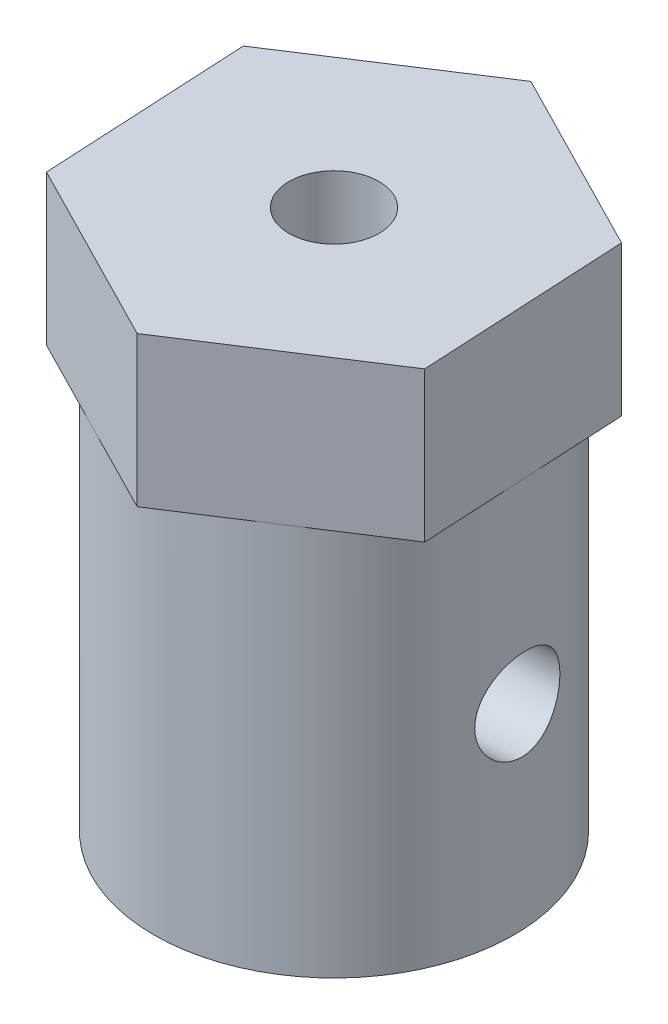
ISO-10303-21;
HEADER;
FILE_DESCRIPTION(('STEP AP214'),'2;1');
FILE_NAME('part.step','',(''),(''),'','','');
FILE_SCHEMA(('AUTOMOTIVE_DESIGN { 1 0 10303 214 1 1 1 1 }'));
ENDSEC;
DATA;
#1=APPLICATION_CONTEXT('core data for automotive mechanical design processes');
#2=APPLICATION_PROTOCOL_DEFINITION('international standard','automotive_design',2000,#1);
#3=PRODUCT_CONTEXT('',#1,'mechanical');
#4=PRODUCT('Part','Part','',(#3));
#5=PRODUCT_RELATED_PRODUCT_CATEGORY('part','',(#4));
#6=PRODUCT_DEFINITION_FORMATION('','',#4);
#7=PRODUCT_DEFINITION_CONTEXT('part definition',#1,'design');
#8=PRODUCT_DEFINITION('design','',#6,#7);
#9=PRODUCT_DEFINITION_SHAPE('','',#8);
#10=(LENGTH_UNIT() NAMED_UNIT(*) SI_UNIT(.MILLI.,.METRE.));
#11=(NAMED_UNIT(*) PLANE_ANGLE_UNIT() SI_UNIT($,.RADIAN.));
#12=(NAMED_UNIT(*) SI_UNIT($,.STERADIAN.) SOLID_ANGLE_UNIT());
#13=UNCERTAINTY_MEASURE_WITH_UNIT(LENGTH_MEASURE(1.E-05),#10,'distance_accuracy_value','');
#14=(GEOMETRIC_REPRESENTATION_CONTEXT(3) GLOBAL_UNCERTAINTY_ASSIGNED_CONTEXT((#13)) GLOBAL_UNIT_ASSIGNED_CONTEXT((#10,
#11,#12)) REPRESENTATION_CONTEXT('',''));
#15=CARTESIAN_POINT('',(0.,0.,0.));
#16=DIRECTION('',(0.,0.,1.));
#17=DIRECTION('',(1.,0.,0.));
#18=AXIS2_PLACEMENT_3D('',#15,#16,#17);
#19=CARTESIAN_POINT('',(0.,0.,0.));
#20=DIRECTION('',(0.,1.,0.));
#21=DIRECTION('',(0.,0.,1.));
#22=AXIS2_PLACEMENT_3D('',#19,#20,#21);
#23=PLANE('',#22);
#24=CARTESIAN_POINT('',(0.,0.,0.));
#25=DIRECTION('',(0.,1.,0.));
#26=DIRECTION('',(0.,0.,1.));
#27=AXIS2_PLACEMENT_3D('',#24,#25,#26);
#28=CIRCLE('',#27,6.);
#29=CARTESIAN_POINT('',(0.,0.,6.));
#30=VERTEX_POINT('',#29);
#31=EDGE_CURVE('E155',#30,#30,#28,.T.);
#32=ORIENTED_EDGE('',*,*,#31,.F.);
#33=EDGE_LOOP('',(#32));
#34=FACE_BOUND('',#33,.T.);
#35=CARTESIAN_POINT('',(0.,0.,0.));
#36=DIRECTION('',(0.,1.,0.));
#37=DIRECTION('',(0.,0.,1.));
#38=AXIS2_PLACEMENT_3D('',#35,#36,#37);
#39=CIRCLE('',#38,4.);
#40=CARTESIAN_POINT('',(0.,0.,4.));
#41=VERTEX_POINT('',#40);
#42=EDGE_CURVE('E148',#41,#41,#39,.T.);
#43=ORIENTED_EDGE('',*,*,#42,.T.);
#44=EDGE_LOOP('',(#43));
#45=FACE_BOUND('',#44,.T.);
#46=ADVANCED_FACE('F40',(#34,#45),#23,.F.);
#47=CARTESIAN_POINT('',(0.,13.,0.));
#48=DIRECTION('',(0.,-1.,0.));
#49=DIRECTION('',(0.,0.,-1.));
#50=AXIS2_PLACEMENT_3D('',#47,#48,#49);
#51=CYLINDRICAL_SURFACE('',#50,6.);
#52=CARTESIAN_POINT('',(5.88075955923414,6.5,1.19023821417238));
#53=CARTESIAN_POINT('',(5.8807610133353,6.58284701075289,1.19023578377256));
#54=CARTESIAN_POINT('',(5.88218338861655,6.66572006655521,1.18326829803772));
#55=CARTESIAN_POINT('',(5.88767363220831,6.82908683956043,1.15563437230053));
#56=CARTESIAN_POINT('',(5.89174303921557,6.90957914438388,1.13495996444772));
#57=CARTESIAN_POINT('',(5.90194576608052,7.06579826643286,1.08064477906496));
#58=CARTESIAN_POINT('',(5.90807643890509,7.14153104843291,1.04702062330652));
#59=CARTESIAN_POINT('',(5.9215608316939,7.28634997504271,0.967844644284609));
#60=CARTESIAN_POINT('',(5.92891460253185,7.35543584299105,0.922292324834173));
#61=CARTESIAN_POINT('',(5.94399761187442,7.48650649217106,0.819533239165163));
#62=CARTESIAN_POINT('',(5.95173139012133,7.54832491831329,0.762114908039063));
#63=CARTESIAN_POINT('',(5.96633669941243,7.66163994214837,0.637761162781821));
#64=CARTESIAN_POINT('',(5.97320815123892,7.7131355917975,0.570824875485727));
#65=CARTESIAN_POINT('',(5.98513037492212,7.80501536930576,0.42824489952741));
#66=CARTESIAN_POINT('',(5.99015496033903,7.84523789443302,0.352494642148474));
#67=CARTESIAN_POINT('',(5.99734059269958,7.91237728558486,0.195182607960277));
#68=CARTESIAN_POINT('',(5.9995020638826,7.93929612250087,0.113621694027576));
#69=CARTESIAN_POINT('',(6.00033576243819,7.97852743160975,-0.0512110344873686));
#70=CARTESIAN_POINT('',(5.99907794368463,7.99112537145142,-0.134414488234723));
#71=CARTESIAN_POINT('',(5.9929974239883,8.00225547823629,-0.301622640158089));
#72=CARTESIAN_POINT('',(5.98817524510342,8.00078970465998,-0.38562721921801));
#73=CARTESIAN_POINT('',(5.9752862143222,7.98403926780058,-0.550104057320061));
#74=CARTESIAN_POINT('',(5.96729299358616,7.96905898580622,-0.63061337319215));
#75=CARTESIAN_POINT('',(5.94858495172654,7.926196023338,-0.787784594101644));
#76=CARTESIAN_POINT('',(5.93786998197136,7.89831263817203,-0.864446288750955));
#77=CARTESIAN_POINT('',(5.91441665223583,7.83017754696666,-1.01259982875378));
#78=CARTESIAN_POINT('',(5.90166039795334,7.78981320437014,-1.08403695134375));
#79=CARTESIAN_POINT('',(5.87523480296585,7.69794750226173,-1.21916504375376));
#80=CARTESIAN_POINT('',(5.86156530280413,7.64644419430724,-1.28285465531969));
#81=CARTESIAN_POINT('',(5.83410219922966,7.53210729843945,-1.40254376939253));
#82=CARTESIAN_POINT('',(5.82031531080342,7.46900394322057,-1.45828738884813));
#83=CARTESIAN_POINT('',(5.79428401979194,7.33412102255417,-1.55851263642701));
#84=CARTESIAN_POINT('',(5.78203968815062,7.26234105835681,-1.60299374666964));
#85=CARTESIAN_POINT('',(5.76024740871639,7.11165460089007,-1.67962847947783));
#86=CARTESIAN_POINT('',(5.75071234999513,7.03271632345053,-1.71172342692963));
#87=CARTESIAN_POINT('',(5.73542349339567,6.87024333712244,-1.76227763889304));
#88=CARTESIAN_POINT('',(5.72966887715849,6.78670962726108,-1.78073985461329));
#89=CARTESIAN_POINT('',(5.72266932793,6.61980857291736,-1.80310579970356));
#90=CARTESIAN_POINT('',(5.7213080286789,6.53649639828512,-1.80738527331968));
#91=CARTESIAN_POINT('',(5.72291270745923,6.37033750878255,-1.80229778412767));
#92=CARTESIAN_POINT('',(5.72587828413222,6.28749075145595,-1.79293208703756));
#93=CARTESIAN_POINT('',(5.73573550469619,6.12602433631559,-1.76113735918001));
#94=CARTESIAN_POINT('',(5.74256161705465,6.04735750716889,-1.73892623727908));
#95=CARTESIAN_POINT('',(5.75940727557399,5.89491816341495,-1.68228869314076));
#96=CARTESIAN_POINT('',(5.7694272019432,5.82114623278596,-1.64786081650164));
#97=CARTESIAN_POINT('',(5.79193108317001,5.67898053522864,-1.5669478901948));
#98=CARTESIAN_POINT('',(5.80445987301744,5.61072207889279,-1.5202377326643));
#99=CARTESIAN_POINT('',(5.83068491872172,5.48297112878702,-1.41632584994999));
#100=CARTESIAN_POINT('',(5.84438136806447,5.4234800922879,-1.35912238416693));
#101=CARTESIAN_POINT('',(5.8720748155774,5.31340790588256,-1.23407191165886));
#102=CARTESIAN_POINT('',(5.88607064432624,5.26309044837491,-1.16599211350134));
#103=CARTESIAN_POINT('',(5.91276082294317,5.17470816512986,-1.02206090443972));
#104=CARTESIAN_POINT('',(5.9254552389065,5.13664271693563,-0.946209888606413));
#105=CARTESIAN_POINT('',(5.94837271561822,5.074170742675,-0.789362097386861));
#106=CARTESIAN_POINT('',(5.95861288470877,5.04966800228584,-0.708406229088545));
#107=CARTESIAN_POINT('',(5.9759378904959,5.01473254083379,-0.543191868469105));
#108=CARTESIAN_POINT('',(5.9830233385935,5.00429709266226,-0.458934019535665));
#109=CARTESIAN_POINT('',(5.9934609231776,4.99794778232186,-0.291952026645471));
#110=CARTESIAN_POINT('',(5.99690922424851,5.00164723453477,-0.209248376409303));
#111=CARTESIAN_POINT('',(6.00038635498654,5.02257912564384,-0.045504022329342));
#112=CARTESIAN_POINT('',(6.00041529133994,5.03981114229876,0.0355367333189054));
#113=CARTESIAN_POINT('',(5.99740430545846,5.08710746682203,0.193209964822155));
#114=CARTESIAN_POINT('',(5.99438171865804,5.11709873358797,0.269864757369501));
#115=CARTESIAN_POINT('',(5.98593197874829,5.1889990795434,0.417218727280239));
#116=CARTESIAN_POINT('',(5.98050452527199,5.23090964721486,0.487917159383259));
#117=CARTESIAN_POINT('',(5.96794992707772,5.32662331404165,0.623135941595858));
#118=CARTESIAN_POINT('',(5.96078544458205,5.38068543718722,0.687469475317304));
#119=CARTESIAN_POINT('',(5.945878021626,5.49866451516468,0.806305978575496));
#120=CARTESIAN_POINT('',(5.93813493517819,5.56258396145276,0.860806455211382));
#121=CARTESIAN_POINT('',(5.92301597921634,5.69990092624957,0.959385865048148));
#122=CARTESIAN_POINT('',(5.91564968629376,5.77345335381124,1.00325082003095));
#123=CARTESIAN_POINT('',(5.90251768447026,5.92704252678331,1.07783543970202));
#124=CARTESIAN_POINT('',(5.89675081646065,6.00707452180116,1.10856463270973));
#125=CARTESIAN_POINT('',(5.88851798110229,6.15580323747724,1.15140487272536));
#126=CARTESIAN_POINT('',(5.88563452696776,6.22378998042875,1.16593466661543));
#127=CARTESIAN_POINT('',(5.88175478658348,6.36117846670682,1.18535194802979));
#128=CARTESIAN_POINT('',(5.88075834080065,6.43058008991386,1.19024025067478));
#129=CARTESIAN_POINT('',(5.88075955923414,6.5,1.19023821417238));
#130=B_SPLINE_CURVE_WITH_KNOTS('',3,(#52,#53,#54,#55,#56,#57,#58,#59,#60,#61,#62,#63,#64,#65,
#66,#67,#68,#69,#70,#71,#72,#73,#74,#75,#76,#77,#78,#79,#80,#81,#82,#83,#84,#85,#86,#87,#88,#89,
#90,#91,#92,#93,#94,#95,#96,#97,#98,#99,#100,#101,#102,#103,#104,#105,#106,#107,#108,#109,#110,
#111,#112,#113,#114,#115,#116,#117,#118,#119,#120,#121,#122,#123,#124,#125,#126,#127,#128,#129),
.UNSPECIFIED.,.T.,.F.,(4,2,2,2,2,2,2,2,2,2,2,2,2,2,2,2,2,2,2,2,2,2,2,2,2,2,2,2,2,2,2,2,2,2,2,2,
2,2,4),(0.,0.248286156849669,0.496716769437786,0.744829563619798,0.992952680421452,
1.24595503392853,1.49898061253562,1.7554667745936,2.0119149277914,2.26315620750269,
2.51436069617597,2.76004490533403,3.00574253391188,3.25372562332925,3.50175212541135,
3.7565158737819,4.01129133475261,4.26725930938248,4.52317185590312,4.77224787590114,
5.02130079322447,5.26624780065584,5.5112239787586,5.76104777462151,6.01091304805877,
6.26710395084826,6.52328183593952,6.77761830010815,7.0319054510934,7.27928657827916,
7.52665998701943,7.7726359530859,8.01864265012273,8.2704973867588,8.52241588478101,
8.77904600848916,9.03548966259335,9.24355341645437,9.45159957922477),.UNSPECIFIED.);
#131=CARTESIAN_POINT('',(5.88075955923414,6.5,1.19023821417238));
#132=VERTEX_POINT('',#131);
#133=EDGE_CURVE('E184',#132,#132,#130,.T.);
#134=ORIENTED_EDGE('',*,*,#133,.T.);
#135=EDGE_LOOP('',(#134));
#136=FACE_BOUND('',#135,.T.);
#137=CARTESIAN_POINT('',(-5.72638585939676,6.5,1.79123002132639));
#138=CARTESIAN_POINT('',(-5.72638755673037,6.41715298924711,1.79122775410075));
#139=CARTESIAN_POINT('',(-5.72852191802188,6.33427993344478,1.78444442816261));
#140=CARTESIAN_POINT('',(-5.7368367956635,6.17091316043957,1.7575253004622));
#141=CARTESIAN_POINT('',(-5.74301966539061,6.09042085561612,1.7373817323723));
#142=CARTESIAN_POINT('',(-5.75877742942915,5.93420173356714,1.68441072264858));
#143=CARTESIAN_POINT('',(-5.76834797418917,5.85846895156709,1.65159954051892));
#144=CARTESIAN_POINT('',(-5.7899374434284,5.71365002495729,1.57423960695554));
#145=CARTESIAN_POINT('',(-5.80195646975477,5.64456415700895,1.52969036724242));
#146=CARTESIAN_POINT('',(-5.82757163725641,5.51349350782894,1.42903854136617));
#147=CARTESIAN_POINT('',(-5.84119414402614,5.45167508168671,1.37272599050415));
#148=CARTESIAN_POINT('',(-5.86856443231799,5.33836005785163,1.25054564700401));
#149=CARTESIAN_POINT('',(-5.88231222522527,5.2868644082025,1.18467697768872));
#150=CARTESIAN_POINT('',(-5.90889615548579,5.19498463069424,1.044090763522));
#151=CARTESIAN_POINT('',(-5.92171725270051,5.15476210556698,0.969264515334629));
#152=CARTESIAN_POINT('',(-5.94511142714536,5.08762271441514,0.813535834562932));
#153=CARTESIAN_POINT('',(-5.95568483722955,5.06070387749913,0.732634304055755));
#154=CARTESIAN_POINT('',(-5.97353777186761,5.02147256839025,0.568769127255519));
#155=CARTESIAN_POINT('',(-5.98087981600297,5.00887462854858,0.485880700974045));
#156=CARTESIAN_POINT('',(-5.99210083681754,4.99774452176371,0.318938712602983));
#157=CARTESIAN_POINT('',(-5.99598032046076,4.99921029534002,0.234885322909918));
#158=CARTESIAN_POINT('',(-6.00014715264744,5.01596073219942,0.0699568690395936));
#159=CARTESIAN_POINT('',(-6.00051156578383,5.03094101419377,-0.0109474492814515));
#160=CARTESIAN_POINT('',(-5.99813599029243,5.073803976662,-0.169210332338367));
#161=CARTESIAN_POINT('',(-5.99539583209925,5.10168736182797,-0.246568703161666));
#162=CARTESIAN_POINT('',(-5.98736901080915,5.16982245303334,-0.396352214373779));
#163=CARTESIAN_POINT('',(-5.98205889740976,5.21018679562986,-0.468724772729413));
#164=CARTESIAN_POINT('',(-5.96973045509371,5.30205249773827,-0.605859461772235));
#165=CARTESIAN_POINT('',(-5.96271182729445,5.35355580569276,-0.670620257937085));
#166=CARTESIAN_POINT('',(-5.94775690835272,5.46789270156055,-0.792505681532079));
#167=CARTESIAN_POINT('',(-5.9398008690435,5.53099605677943,-0.849375100739574));
#168=CARTESIAN_POINT('',(-5.92425990501376,5.66587897744583,-0.951752865908575));
#169=CARTESIAN_POINT('',(-5.91667499737182,5.73765894164319,-0.997260689431814));
#170=CARTESIAN_POINT('',(-5.90291398119969,5.88834539910993,-1.07573629168776));
#171=CARTESIAN_POINT('',(-5.89674463293249,5.96728367654947,-1.10864437790847));
#172=CARTESIAN_POINT('',(-5.88675870250648,6.12975666287756,-1.16050726133088));
#173=CARTESIAN_POINT('',(-5.88294161116159,6.21329037273892,-1.17946507847852));
#174=CARTESIAN_POINT('',(-5.87828941587081,6.38019142708264,-1.20243432461677));
#175=CARTESIAN_POINT('',(-5.87737737427928,6.46350360171488,-1.20683150669367));
#176=CARTESIAN_POINT('',(-5.87844804319817,6.62966249121745,-1.20160549403266));
#177=CARTESIAN_POINT('',(-5.88043048521802,6.71250924854405,-1.19198359969605));
#178=CARTESIAN_POINT('',(-5.88695127881776,6.87397566368441,-1.15934085520953));
#179=CARTESIAN_POINT('',(-5.89144695462099,6.95264249283111,-1.13654351665652));
#180=CARTESIAN_POINT('',(-5.90235308385415,7.10508183658505,-1.078469047549));
#181=CARTESIAN_POINT('',(-5.90876376525065,7.17885376721404,-1.04319043110284));
#182=CARTESIAN_POINT('',(-5.92279073204329,7.32101946477136,-0.960386019889397));
#183=CARTESIAN_POINT('',(-5.93042836384653,7.38927792110721,-0.912631690535895));
#184=CARTESIAN_POINT('',(-5.94578129592427,7.51702887121298,-0.806566993920857));
#185=CARTESIAN_POINT('',(-5.95349660888332,7.5765199077121,-0.748254875385028));
#186=CARTESIAN_POINT('',(-5.9681269263698,7.68659209411744,-0.621012973796406));
#187=CARTESIAN_POINT('',(-5.97501672535492,7.73690955162509,-0.551851764947224));
#188=CARTESIAN_POINT('',(-5.98669916282035,7.82529183487014,-0.405933708383246));
#189=CARTESIAN_POINT('',(-5.99149190784482,7.86335728306437,-0.329177246800359));
#190=CARTESIAN_POINT('',(-5.99808781146294,7.925829257325,-0.170801319321638));
#191=CARTESIAN_POINT('',(-5.99991221173831,7.95033199771415,-0.0892207748360039));
#192=CARTESIAN_POINT('',(-6.00008146273686,7.98526745916621,0.0768993989374233));
#193=CARTESIAN_POINT('',(-5.99842698803977,7.99570290733774,0.161438451422716));
#194=CARTESIAN_POINT('',(-5.99156308995329,8.00205221767814,0.328605481738474));
#195=CARTESIAN_POINT('',(-5.9864514334679,7.99835276546522,0.411223007183365));
#196=CARTESIAN_POINT('',(-5.97299868161436,7.97742087435616,0.574450846104304));
#197=CARTESIAN_POINT('',(-5.9646576870117,7.96018885770124,0.655061222126191));
#198=CARTESIAN_POINT('',(-5.94537853103025,7.91289253317797,0.811580320364389));
#199=CARTESIAN_POINT('',(-5.93445530754727,7.88290126641203,0.887513030313287));
#200=CARTESIAN_POINT('',(-5.91083224040064,7.8110009204566,1.03320634262234));
#201=CARTESIAN_POINT('',(-5.89813217494572,7.76909035278514,1.10296617268595));
#202=CARTESIAN_POINT('',(-5.87167950564144,7.67337668595835,1.23616524657746));
#203=CARTESIAN_POINT('',(-5.8579090578154,7.61931456281278,1.29941481683046));
#204=CARTESIAN_POINT('',(-5.83080808448038,7.50133548483532,1.41607622008844));
#205=CARTESIAN_POINT('',(-5.81747767122795,7.43741603854724,1.46948555844603));
#206=CARTESIAN_POINT('',(-5.79225842042344,7.30009907375043,1.56597634692867));
#207=CARTESIAN_POINT('',(-5.7804012076236,7.22654664618876,1.60884595214826));
#208=CARTESIAN_POINT('',(-5.7596364341176,7.07295747321669,1.68167547325485));
#209=CARTESIAN_POINT('',(-5.75072673642957,6.99292547819884,1.71164474679715));
#210=CARTESIAN_POINT('',(-5.73811344619108,6.84419676252276,1.75340562145268));
#211=CARTESIAN_POINT('',(-5.73374479457465,6.77621001957124,1.76755991766578));
#212=CARTESIAN_POINT('',(-5.72788041148725,6.63882153329318,1.78647267034691));
#213=CARTESIAN_POINT('',(-5.72638443715176,6.56941991008614,1.79123192110042));
#214=CARTESIAN_POINT('',(-5.72638585939676,6.5,1.79123002132639));
#215=B_SPLINE_CURVE_WITH_KNOTS('',3,(#137,#138,#139,#140,#141,#142,#143,#144,#145,#146,#147,
#148,#149,#150,#151,#152,#153,#154,#155,#156,#157,#158,#159,#160,#161,#162,#163,#164,#165,#166,
#167,#168,#169,#170,#171,#172,#173,#174,#175,#176,#177,#178,#179,#180,#181,#182,#183,#184,#185,
#186,#187,#188,#189,#190,#191,#192,#193,#194,#195,#196,#197,#198,#199,#200,#201,#202,#203,#204,
#205,#206,#207,#208,#209,#210,#211,#212,#213,#214),.UNSPECIFIED.,.T.,.F.,(4,2,2,2,2,2,2,2,2,2,2,
2,2,2,2,2,2,2,2,2,2,2,2,2,2,2,2,2,2,2,2,2,2,2,2,2,2,2,4),(0.,0.248286156849669,
0.496716769437786,0.744829563619798,0.992952680421452,1.24595503392853,1.49898061253562,
1.7554667745936,2.0119149277914,2.26315620750269,2.51436069617597,2.76004490533403,
3.00574253391188,3.25372562332925,3.50175212541135,3.7565158737819,4.01129133475261,
4.26725930938248,4.52317185590312,4.77224787590114,5.02130079322447,5.26624780065584,
5.5112239787586,5.76104777462151,6.01091304805877,6.26710395084826,6.52328183593952,
6.77761830010815,7.0319054510934,7.27928657827916,7.52665998701943,7.7726359530859,
8.01864265012273,8.27049738675881,8.52241588478101,8.77904600848916,9.03548966259335,
9.24355341645437,9.45159957922477),.UNSPECIFIED.);
#216=CARTESIAN_POINT('',(-5.72638585939676,6.5,1.79123002132639));
#217=VERTEX_POINT('',#216);
#218=EDGE_CURVE('E179',#217,#217,#215,.T.);
#219=ORIENTED_EDGE('',*,*,#218,.T.);
#220=EDGE_LOOP('',(#219));
#221=FACE_BOUND('',#220,.T.);
#222=CARTESIAN_POINT('',(0.,13.,0.));
#223=DIRECTION('',(0.,1.,0.));
#224=DIRECTION('',(0.,0.,1.));
#225=AXIS2_PLACEMENT_3D('',#222,#223,#224);
#226=CIRCLE('',#225,6.);
#227=CARTESIAN_POINT('',(3.26467179434254,13.,5.03407569224224));
#228=VERTEX_POINT('',#227);
#229=CARTESIAN_POINT('',(5.99197333122679,13.,-0.310250862798045));
#230=VERTEX_POINT('',#229);
#231=EDGE_CURVE('E11',#228,#230,#226,.T.);
#232=ORIENTED_EDGE('',*,*,#231,.F.);
#233=CARTESIAN_POINT('',(-2.72730153688425,13.,5.34432655504029));
#234=VERTEX_POINT('',#233);
#235=EDGE_CURVE('E57',#234,#228,#226,.T.);
#236=ORIENTED_EDGE('',*,*,#235,.F.);
#237=CARTESIAN_POINT('',(-5.99197333122679,13.,0.310250862798045));
#238=VERTEX_POINT('',#237);
#239=EDGE_CURVE('E67',#238,#234,#226,.T.);
#240=ORIENTED_EDGE('',*,*,#239,.F.);
#241=CARTESIAN_POINT('',(-3.26467179434254,13.,-5.03407569224225));
#242=VERTEX_POINT('',#241);
#243=EDGE_CURVE('E244',#242,#238,#226,.T.);
#244=ORIENTED_EDGE('',*,*,#243,.F.);
#245=CARTESIAN_POINT('',(2.72730153688425,13.,-5.34432655504029));
#246=VERTEX_POINT('',#245);
#247=EDGE_CURVE('E241',#246,#242,#226,.T.);
#248=ORIENTED_EDGE('',*,*,#247,.F.);
#249=EDGE_CURVE('E55',#230,#246,#226,.T.);
#250=ORIENTED_EDGE('',*,*,#249,.F.);
#251=EDGE_LOOP('',(#232,#236,#240,#244,#248,#250));
#252=FACE_BOUND('',#251,.T.);
#253=ORIENTED_EDGE('',*,*,#31,.T.);
#254=EDGE_LOOP('',(#253));
#255=FACE_BOUND('',#254,.T.);
#256=ADVANCED_FACE('F42',(#136,#221,#252,#255),#51,.T.);
#257=CARTESIAN_POINT('',(0.,13.,0.));
#258=DIRECTION('',(0.,-1.,0.));
#259=DIRECTION('',(0.,0.,-1.));
#260=AXIS2_PLACEMENT_3D('',#257,#258,#259);
#261=CYLINDRICAL_SURFACE('',#260,4.);
#262=CARTESIAN_POINT('',(3.78325370366801,6.5,1.2988423359601));
#263=CARTESIAN_POINT('',(3.78325104539542,6.58104559855913,1.29884550245176));
#264=CARTESIAN_POINT('',(3.78558017489681,6.66207120585491,1.29212290486426));
#265=CARTESIAN_POINT('',(3.7945476602837,6.82168074478298,1.26554439755667));
#266=CARTESIAN_POINT('',(3.80118587619302,6.90026475564111,1.24568891444427));
#267=CARTESIAN_POINT('',(3.8178262688696,7.05264301070002,1.19370731770391));
#268=CARTESIAN_POINT('',(3.82782045198803,7.12644814413985,1.16161033791305));
#269=CARTESIAN_POINT('',(3.84989453420092,7.26774959715858,1.08620918102964));
#270=CARTESIAN_POINT('',(3.86197505770994,7.33524401867505,1.04290164682248));
#271=CARTESIAN_POINT('',(3.88734066807272,7.46533232609149,0.944083570479931));
#272=CARTESIAN_POINT('',(3.90065547178474,7.52757133698377,0.888113354656535));
#273=CARTESIAN_POINT('',(3.92633965999662,7.64215756678417,0.766621429436793));
#274=CARTESIAN_POINT('',(3.93870884629568,7.69450271531181,0.701097725956713));
#275=CARTESIAN_POINT('',(3.96131095916946,7.78950232677416,0.559732171908272));
#276=CARTESIAN_POINT('',(3.97145888552728,7.83177539182278,0.483619090747592));
#277=CARTESIAN_POINT('',(3.98757579928112,7.90287616240378,0.324939439429288));
#278=CARTESIAN_POINT('',(3.99354624288282,7.93170855197628,0.242375129237895));
#279=CARTESIAN_POINT('',(4.00007823748743,7.97385738482651,0.0769696931085342));
#280=CARTESIAN_POINT('',(4.00086257382836,7.98779101008939,-0.00570499030542944));
#281=CARTESIAN_POINT('',(3.99716139642239,8.0017287928575,-0.172094269390754));
#282=CARTESIAN_POINT('',(3.99267757605568,8.00173742514476,-0.255808522349906));
#283=CARTESIAN_POINT('',(3.97893511500808,7.98818561089808,-0.417546335012913));
#284=CARTESIAN_POINT('',(3.96992119386946,7.97528999647856,-0.495647746695976));
#285=CARTESIAN_POINT('',(3.9478734234549,7.93741784656397,-0.648261514984974));
#286=CARTESIAN_POINT('',(3.93483927982623,7.91244042638688,-0.722773608326102));
#287=CARTESIAN_POINT('',(3.90551509062974,7.85078463493091,-0.867460566784815));
#288=CARTESIAN_POINT('',(3.88917873802391,7.81393483517485,-0.937552685796415));
#289=CARTESIAN_POINT('',(3.85467390541979,7.72973133807005,-1.07061718789517));
#290=CARTESIAN_POINT('',(3.83650483119055,7.68237422788339,-1.1335872476385));
#291=CARTESIAN_POINT('',(3.79871534561799,7.57524464416712,-1.25459746670244));
#292=CARTESIAN_POINT('',(3.77907241332317,7.51490588976357,-1.31213004731142));
#293=CARTESIAN_POINT('',(3.74120779278792,7.38517275952807,-1.41649334661698));
#294=CARTESIAN_POINT('',(3.72298646249191,7.31577611469644,-1.46332137571171));
#295=CARTESIAN_POINT('',(3.68945676307303,7.16792857450546,-1.54594542523609));
#296=CARTESIAN_POINT('',(3.67422101968277,7.08931252412084,-1.58147705850943));
#297=CARTESIAN_POINT('',(3.64899674565916,6.92644974486874,-1.63884615141806));
#298=CARTESIAN_POINT('',(3.63900525298591,6.84220622486773,-1.6606913427364));
#299=CARTESIAN_POINT('',(3.62595845802015,6.67552036479774,-1.6889807124687));
#300=CARTESIAN_POINT('',(3.62254660729942,6.59324063207307,-1.69621762760963));
#301=CARTESIAN_POINT('',(3.62200025474639,6.42857684899027,-1.69738529001199));
#302=CARTESIAN_POINT('',(3.62486417588846,6.34619283003732,-1.69131938011225));
#303=CARTESIAN_POINT('',(3.63621890044102,6.18778992043526,-1.66675654176057));
#304=CARTESIAN_POINT('',(3.64443392114888,6.11165508131807,-1.64886828007903));
#305=CARTESIAN_POINT('',(3.66531897645264,5.96357034401862,-1.60190279481557));
#306=CARTESIAN_POINT('',(3.67798992796923,5.89162131072602,-1.57282326823096));
#307=CARTESIAN_POINT('',(3.70707691161132,5.75092115680159,-1.50301634216581));
#308=CARTESIAN_POINT('',(3.72361658182378,5.68239427548251,-1.46188959681943));
#309=CARTESIAN_POINT('',(3.75857131638549,5.55306353636647,-1.3695171654353));
#310=CARTESIAN_POINT('',(3.77698707075302,5.49226253873852,-1.31826774975514));
#311=CARTESIAN_POINT('',(3.81527551030622,5.376066760812,-1.20315292531797));
#312=CARTESIAN_POINT('',(3.83516592402404,5.32126824966648,-1.13868944633782));
#313=CARTESIAN_POINT('',(3.8733830974778,5.22335281746228,-1.00100024683046));
#314=CARTESIAN_POINT('',(3.89170984572716,5.1802359822114,-0.927774461945408));
#315=CARTESIAN_POINT('',(3.92506515783598,5.10717487431887,-0.774585266614094));
#316=CARTESIAN_POINT('',(3.94010356672949,5.07719100448633,-0.694642988051151));
#317=CARTESIAN_POINT('',(3.96558911879261,5.03138351992398,-0.530111345355432));
#318=CARTESIAN_POINT('',(3.97603842743628,5.0155532228399,-0.445524194259391));
#319=CARTESIAN_POINT('',(3.99104932944088,4.99922665754026,-0.279415238758548));
#320=CARTESIAN_POINT('',(3.99591946304326,4.99788790231097,-0.198003398264896));
#321=CARTESIAN_POINT('',(4.00066034943608,5.00841970458917,-0.0359010766104167));
#322=CARTESIAN_POINT('',(4.00053172116453,5.02028862656828,0.0447894926194686));
#323=CARTESIAN_POINT('',(3.9956890501557,5.05630251921533,0.201090251051738));
#324=CARTESIAN_POINT('',(3.9910894761591,5.08013386285778,0.276776961654941));
#325=CARTESIAN_POINT('',(3.97822209630251,5.13908894336011,0.423275224764666));
#326=CARTESIAN_POINT('',(3.96995360279355,5.17421479675888,0.494085860495161));
#327=CARTESIAN_POINT('',(3.95039509695282,5.25642309524066,0.632006846636329));
#328=CARTESIAN_POINT('',(3.93899374824219,5.30394195481035,0.698840927276607));
#329=CARTESIAN_POINT('',(3.91474416159215,5.40889909970129,0.823920002367386));
#330=CARTESIAN_POINT('',(3.90189541156079,5.46634089962705,0.882161939971105));
#331=CARTESIAN_POINT('',(3.8755974910353,5.59311019742378,0.991501022615166));
#332=CARTESIAN_POINT('',(3.86215235682538,5.66290449058644,1.04205999269821));
#333=CARTESIAN_POINT('',(3.83715424370035,5.81037158999001,1.13065210850561));
#334=CARTESIAN_POINT('',(3.82560146983852,5.88804524855218,1.16868389725456));
#335=CARTESIAN_POINT('',(3.80562655488516,6.05285213200435,1.23222469558994));
#336=CARTESIAN_POINT('',(3.79736742936789,6.14025299620283,1.25709797351828));
#337=CARTESIAN_POINT('',(3.78618423405746,6.31844576726906,1.29039965159875));
#338=CARTESIAN_POINT('',(3.7832566807204,6.40923542036179,1.29883878974304));
#339=CARTESIAN_POINT('',(3.78325370366801,6.5,1.2988423359601));
#340=B_SPLINE_CURVE_WITH_KNOTS('',3,(#262,#263,#264,#265,#266,#267,#268,#269,#270,#271,#272,
#273,#274,#275,#276,#277,#278,#279,#280,#281,#282,#283,#284,#285,#286,#287,#288,#289,#290,#291,
#292,#293,#294,#295,#296,#297,#298,#299,#300,#301,#302,#303,#304,#305,#306,#307,#308,#309,#310,
#311,#312,#313,#314,#315,#316,#317,#318,#319,#320,#321,#322,#323,#324,#325,#326,#327,#328,#329,
#330,#331,#332,#333,#334,#335,#336,#337,#338,#339),.UNSPECIFIED.,.T.,.F.,(4,2,2,2,2,2,2,2,2,2,2,
2,2,2,2,2,2,2,2,2,2,2,2,2,2,2,2,2,2,2,2,2,2,2,2,2,2,2,4),(0.,0.242798992086799,
0.485590097496011,0.727806948143385,0.97009641717249,1.22323751097267,1.47643151833942,
1.73806943194444,1.99961609713272,2.24984986288879,2.50000321626804,2.73789964570595,
2.97581349758603,3.21732939543752,3.45892385425036,3.71472378057027,3.97058790813967,
4.23206185415098,4.4933879559774,4.7401042714909,4.98675859728591,5.22161138770305,
5.45651253333972,5.7003080161115,5.9441934921158,6.20371038050797,6.46322917513064,
6.72196001619028,6.98056863754219,7.22405591353394,7.46751304145077,7.70489683771594,
7.94232514455746,8.18962541468845,8.43701345632615,8.69743679233837,8.9578883287834,
9.22998159896601,9.50189702491305),.UNSPECIFIED.);
#341=CARTESIAN_POINT('',(3.78325370366801,6.5,1.2988423359601));
#342=VERTEX_POINT('',#341);
#343=EDGE_CURVE('E45',#342,#342,#340,.T.);
#344=ORIENTED_EDGE('',*,*,#343,.F.);
#345=EDGE_LOOP('',(#344));
#346=FACE_BOUND('',#345,.T.);
#347=CARTESIAN_POINT('',(-3.62888000383062,6.5,1.68262589953866));
#348=CARTESIAN_POINT('',(-3.6288770327424,6.41895440144087,1.68262877455471));
#349=CARTESIAN_POINT('',(-3.63188800764941,6.33792879414509,1.67618267552764));
#350=CARTESIAN_POINT('',(-3.64355253027673,6.17831925521701,1.65067244705471));
#351=CARTESIAN_POINT('',(-3.65220589470992,6.09973524435889,1.63160872747872));
#352=CARTESIAN_POINT('',(-3.67412588914794,5.94735698929997,1.58162370060122));
#353=CARTESIAN_POINT('',(-3.68738155934819,5.87355185586015,1.55073054576973));
#354=CARTESIAN_POINT('',(-3.71712492599617,5.73225040284142,1.478012379502));
#355=CARTESIAN_POINT('',(-3.73361359023751,5.66475598132494,1.43618409339209));
#356=CARTESIAN_POINT('',(-3.76904935026207,5.53466767390851,1.34051417485653));
#357=CARTESIAN_POINT('',(-3.78807347844904,5.47242866301623,1.28621839597886));
#358=CARTESIAN_POINT('',(-3.82616783620649,5.35784243321583,1.16802878000203));
#359=CARTESIAN_POINT('',(-3.84523807458222,5.30549728468819,1.10413293901266));
#360=CARTESIAN_POINT('',(-3.88231935917,5.21049767322584,0.965857656654961));
#361=CARTESIAN_POINT('',(-3.90027387202394,5.16822460817722,0.891199656405063));
#362=CARTESIAN_POINT('',(-3.932692813128,5.09712383759623,0.735033082167365));
#363=CARTESIAN_POINT('',(-3.94715845639054,5.06829144802372,0.653526906455443));
#364=CARTESIAN_POINT('',(-3.97073836369389,5.02614261517349,0.489680596682463));
#365=CARTESIAN_POINT('',(-3.98005703176899,5.01220898991061,0.407529024047479));
#366=CARTESIAN_POINT('',(-3.99356009921733,4.9982712071425,0.2416472647181));
#367=CARTESIAN_POINT('',(-3.99774614752053,4.99826257485524,0.157917593793193));
#368=CARTESIAN_POINT('',(-4.00078123046023,5.01181438910192,-0.00437462275525384));
#369=CARTESIAN_POINT('',(-3.99988171643694,5.02471000352144,-0.0829893297489363));
#370=CARTESIAN_POINT('',(-3.99371358434949,5.06258215343603,-0.237064053821941));
#371=CARTESIAN_POINT('',(-3.98844464631702,5.08755957361312,-0.312523839444616));
#372=CARTESIAN_POINT('',(-3.9742203364748,5.14921536506909,-0.459465640949759));
#373=CARTESIAN_POINT('',(-3.96521035935304,5.18606516482515,-0.530870135740099));
#374=CARTESIAN_POINT('',(-3.94463275868255,5.27026866192995,-0.66678668198254));
#375=CARTESIAN_POINT('',(-3.93306430412885,5.3176257721166,-0.73129648388632));
#376=CARTESIAN_POINT('',(-3.90797466574073,5.42475535583288,-0.855562442150421));
#377=CARTESIAN_POINT('',(-3.89437865936492,5.48509411023643,-0.914816060025596));
#378=CARTESIAN_POINT('',(-3.8674950171452,5.61482724047193,-1.0225318783218));
#379=CARTESIAN_POINT('',(-3.85420745955325,5.68422388530356,-1.07099136655573));
#380=CARTESIAN_POINT('',(-3.82939035791699,5.83207142549454,-1.15663648182393));
#381=CARTESIAN_POINT('',(-3.81790574570001,5.91068747587916,-1.19355163483662));
#382=CARTESIAN_POINT('',(-3.79874135922402,6.07355025513126,-1.25321907245695));
#383=CARTESIAN_POINT('',(-3.79105943728215,6.15779377513227,-1.27597935331755));
#384=CARTESIAN_POINT('',(-3.78100409713733,6.32447963520226,-1.30546489949362));
#385=CARTESIAN_POINT('',(-3.77835790990427,6.40675936792693,-1.31301548617448));
#386=CARTESIAN_POINT('',(-3.77793507353407,6.57142315100972,-1.31423333099305));
#387=CARTESIAN_POINT('',(-3.78015720104823,6.65380716996268,-1.30790407696667));
#388=CARTESIAN_POINT('',(-3.78891439014628,6.81221007956474,-1.28229988909327));
#389=CARTESIAN_POINT('',(-3.79523800603986,6.88834491868193,-1.26365884960379));
#390=CARTESIAN_POINT('',(-3.8111608480002,7.03642965598137,-1.21478753444879));
#391=CARTESIAN_POINT('',(-3.82076074823348,7.10837868927398,-1.18455487339767));
#392=CARTESIAN_POINT('',(-3.84248262629829,7.24907884319841,-1.11211717908457));
#393=CARTESIAN_POINT('',(-3.85468633717393,7.31760572451749,-1.06950216630285));
#394=CARTESIAN_POINT('',(-3.87991405424759,7.44693646363353,-0.974013623328584));
#395=CARTESIAN_POINT('',(-3.89293836158173,7.50773746126148,-0.921136312173907));
#396=CARTESIAN_POINT('',(-3.9191331539124,7.623933239188,-0.802682691446755));
#397=CARTESIAN_POINT('',(-3.93225950477864,7.67873175033352,-0.73650967887345));
#398=CARTESIAN_POINT('',(-3.95605196213436,7.77664718253772,-0.595609760559958));
#399=CARTESIAN_POINT('',(-3.96671805055187,7.8197640177886,-0.520882791992394));
#400=CARTESIAN_POINT('',(-3.9840738275764,7.89282512568113,-0.365067890856439));
#401=CARTESIAN_POINT('',(-3.99077549104225,7.92280899551367,-0.283999960386531));
#402=CARTESIAN_POINT('',(-3.99913215967953,7.96861648007602,-0.117716043841964));
#403=CARTESIAN_POINT('',(-4.00078954730442,7.9844467771601,-0.0325020353226135));
#404=CARTESIAN_POINT('',(-3.99856467675561,8.00077334245974,0.134268952045134));
#405=CARTESIAN_POINT('',(-3.99500066581354,8.00211209768903,0.215748420623874));
#406=CARTESIAN_POINT('',(-3.98297449845826,7.99158029541083,0.377473526863766));
#407=CARTESIAN_POINT('',(-3.97451294857761,7.97971137343172,0.45771931604608));
#408=CARTESIAN_POINT('',(-3.9535536495705,7.94369748078467,0.612684106673283));
#409=CARTESIAN_POINT('',(-3.94116185403577,7.91986613714222,0.687491042490149));
#410=CARTESIAN_POINT('',(-3.91323314662364,7.86091105663989,0.831876976226187));
#411=CARTESIAN_POINT('',(-3.89769564545782,7.82578520324112,0.901454991252393));
#412=CARTESIAN_POINT('',(-3.86399744228281,7.74357690475934,1.03661846513365));
#413=CARTESIAN_POINT('',(-3.8457545320263,7.69605804518965,1.10191763291415));
#414=CARTESIAN_POINT('',(-3.80871662841541,7.59110090029871,1.22382338000744));
#415=CARTESIAN_POINT('',(-3.7899214414144,7.53365910037295,1.2804268659319));
#416=CARTESIAN_POINT('',(-3.75247176192924,7.40688980257622,1.38646524164498));
#417=CARTESIAN_POINT('',(-3.73387686610417,7.33709550941356,1.43536525124657));
#418=CARTESIAN_POINT('',(-3.69986276105588,7.18962841000999,1.52090184751278));
#419=CARTESIAN_POINT('',(-3.68444389593593,7.11195475144782,1.55753710563607));
#420=CARTESIAN_POINT('',(-3.65801339247034,6.94714786799565,1.61867513608396));
#421=CARTESIAN_POINT('',(-3.64722955544676,6.85974700379717,1.64256241236778));
#422=CARTESIAN_POINT('',(-3.63266681177753,6.68155423273094,1.67453102380384));
#423=CARTESIAN_POINT('',(-3.62888333121149,6.59076457963821,1.68262267975094));
#424=CARTESIAN_POINT('',(-3.62888000383062,6.5,1.68262589953866));
#425=B_SPLINE_CURVE_WITH_KNOTS('',3,(#347,#348,#349,#350,#351,#352,#353,#354,#355,#356,#357,
#358,#359,#360,#361,#362,#363,#364,#365,#366,#367,#368,#369,#370,#371,#372,#373,#374,#375,#376,
#377,#378,#379,#380,#381,#382,#383,#384,#385,#386,#387,#388,#389,#390,#391,#392,#393,#394,#395,
#396,#397,#398,#399,#400,#401,#402,#403,#404,#405,#406,#407,#408,#409,#410,#411,#412,#413,#414,
#415,#416,#417,#418,#419,#420,#421,#422,#423,#424),.UNSPECIFIED.,.T.,.F.,(4,2,2,2,2,2,2,2,2,2,2,
2,2,2,2,2,2,2,2,2,2,2,2,2,2,2,2,2,2,2,2,2,2,2,2,2,2,2,4),(0.,0.242798992086799,0.48559009749601,
0.727806948143386,0.97009641717249,1.22323751097267,1.47643151833942,1.73806943194444,
1.99961609713272,2.24984986288878,2.50000321626804,2.73789964570595,2.97581349758603,
3.21732939543752,3.45892385425037,3.71472378057027,3.97058790813967,4.23206185415098,
4.49338795597739,4.7401042714909,4.98675859728591,5.22161138770304,5.45651253333972,
5.7003080161115,5.94419349211579,6.20371038050796,6.46322917513064,6.72196001619028,
6.98056863754219,7.22405591353394,7.46751304145077,7.70489683771594,7.94232514455746,
8.18962541468845,8.43701345632615,8.69743679233837,8.95788832878339,9.22998159896601,
9.50189702491305),.UNSPECIFIED.);
#426=CARTESIAN_POINT('',(-3.62888000383062,6.5,1.68262589953866));
#427=VERTEX_POINT('',#426);
#428=EDGE_CURVE('E158',#427,#427,#425,.T.);
#429=ORIENTED_EDGE('',*,*,#428,.F.);
#430=EDGE_LOOP('',(#429));
#431=FACE_BOUND('',#430,.T.);
#432=CARTESIAN_POINT('',(0.,13.,0.));
#433=DIRECTION('',(0.,1.,0.));
#434=DIRECTION('',(0.,0.,1.));
#435=AXIS2_PLACEMENT_3D('',#432,#433,#434);
#436=CIRCLE('',#435,4.);
#437=CARTESIAN_POINT('',(0.,13.,4.));
#438=VERTEX_POINT('',#437);
#439=EDGE_CURVE('E145',#438,#438,#436,.T.);
#440=ORIENTED_EDGE('',*,*,#439,.T.);
#441=EDGE_LOOP('',(#440));
#442=FACE_BOUND('',#441,.T.);
#443=ORIENTED_EDGE('',*,*,#42,.F.);
#444=EDGE_LOOP('',(#443));
#445=FACE_BOUND('',#444,.T.);
#446=ADVANCED_FACE('F163',(#346,#431,#442,#445),#261,.F.);
#447=CARTESIAN_POINT('',(0.,13.,0.));
#448=DIRECTION('',(0.,1.,0.));
#449=DIRECTION('',(0.,0.,1.));
#450=AXIS2_PLACEMENT_3D('',#447,#448,#449);
#451=PLANE('',#450);
#452=DIRECTION('',(0.839012615373708,0.,-0.544111965723757));
#453=VECTOR('',#452,1.);
#454=CARTESIAN_POINT('',(0.35824683830553,13.,6.91893483152169));
#455=LINE('',#454,#453);
#456=CARTESIAN_POINT('',(6.17109675037955,13.,3.1492165529628));
#457=VERTEX_POINT('',#456);
#458=EDGE_CURVE('E143',#228,#457,#455,.T.);
#459=ORIENTED_EDGE('',*,*,#458,.F.);
#460=ORIENTED_EDGE('',*,*,#231,.T.);
#461=DIRECTION('',(-0.0517084771330075,0.,-0.998662221871132));
#462=VECTOR('',#461,1.);
#463=CARTESIAN_POINT('',(6.17109675037955,13.,3.1492165529628));
#464=LINE('',#463,#462);
#465=EDGE_CURVE('E206',#457,#230,#464,.T.);
#466=ORIENTED_EDGE('',*,*,#465,.F.);
#467=EDGE_LOOP('',(#459,#460,#466));
#468=FACE_BOUND('',#467,.T.);
#469=ADVANCED_FACE('F260',(#468),#451,.F.);
#470=CARTESIAN_POINT('',(5.81284991207402,13.,-3.76971827855889));
#471=VERTEX_POINT('',#470);
#472=EDGE_CURVE('E205',#230,#471,#464,.T.);
#473=ORIENTED_EDGE('',*,*,#472,.F.);
#474=ORIENTED_EDGE('',*,*,#249,.T.);
#475=DIRECTION('',(-0.890721092506715,0.,-0.454550256147375));
#476=VECTOR('',#475,1.);
#477=CARTESIAN_POINT('',(5.81284991207402,13.,-3.76971827855889));
#478=LINE('',#477,#476);
#479=EDGE_CURVE('E209',#471,#246,#478,.T.);
#480=ORIENTED_EDGE('',*,*,#479,.F.);
#481=EDGE_LOOP('',(#473,#474,#480));
#482=FACE_BOUND('',#481,.T.);
#483=ADVANCED_FACE('F257',(#482),#451,.F.);
#484=CARTESIAN_POINT('',(-0.358246838305528,13.,-6.91893483152169));
#485=VERTEX_POINT('',#484);
#486=EDGE_CURVE('E208',#246,#485,#478,.T.);
#487=ORIENTED_EDGE('',*,*,#486,.F.);
#488=ORIENTED_EDGE('',*,*,#247,.T.);
#489=DIRECTION('',(-0.839012615373708,0.,0.544111965723757));
#490=VECTOR('',#489,1.);
#491=CARTESIAN_POINT('',(-0.358246838305528,13.,-6.91893483152169));
#492=LINE('',#491,#490);
#493=EDGE_CURVE('E213',#485,#242,#492,.T.);
#494=ORIENTED_EDGE('',*,*,#493,.F.);
#495=EDGE_LOOP('',(#487,#488,#494));
#496=FACE_BOUND('',#495,.T.);
#497=ADVANCED_FACE('F240',(#496),#451,.F.);
#498=CARTESIAN_POINT('',(-6.17109675037955,13.,-3.1492165529628));
#499=VERTEX_POINT('',#498);
#500=EDGE_CURVE('E212',#242,#499,#492,.T.);
#501=ORIENTED_EDGE('',*,*,#500,.F.);
#502=ORIENTED_EDGE('',*,*,#243,.T.);
#503=DIRECTION('',(0.0517084771330075,0.,0.998662221871132));
#504=VECTOR('',#503,1.);
#505=CARTESIAN_POINT('',(-6.17109675037955,13.,-3.1492165529628));
#506=LINE('',#505,#504);
#507=EDGE_CURVE('E217',#499,#238,#506,.T.);
#508=ORIENTED_EDGE('',*,*,#507,.F.);
#509=EDGE_LOOP('',(#501,#502,#508));
#510=FACE_BOUND('',#509,.T.);
#511=ADVANCED_FACE('F247',(#510),#451,.F.);
#512=CARTESIAN_POINT('',(-5.81284991207402,13.,3.76971827855889));
#513=VERTEX_POINT('',#512);
#514=EDGE_CURVE('E216',#238,#513,#506,.T.);
#515=ORIENTED_EDGE('',*,*,#514,.F.);
#516=ORIENTED_EDGE('',*,*,#239,.T.);
#517=DIRECTION('',(0.890721092506715,0.,0.454550256147375));
#518=VECTOR('',#517,1.);
#519=CARTESIAN_POINT('',(-5.81284991207402,13.,3.76971827855889));
#520=LINE('',#519,#518);
#521=EDGE_CURVE('E138',#513,#234,#520,.T.);
#522=ORIENTED_EDGE('',*,*,#521,.F.);
#523=EDGE_LOOP('',(#515,#516,#522));
#524=FACE_BOUND('',#523,.T.);
#525=ADVANCED_FACE('F267',(#524),#451,.F.);
#526=CARTESIAN_POINT('',(0.35824683830553,13.,6.91893483152169));
#527=VERTEX_POINT('',#526);
#528=EDGE_CURVE('E220',#234,#527,#520,.T.);
#529=ORIENTED_EDGE('',*,*,#528,.F.);
#530=ORIENTED_EDGE('',*,*,#235,.T.);
#531=EDGE_CURVE('E203',#527,#228,#455,.T.);
#532=ORIENTED_EDGE('',*,*,#531,.F.);
#533=EDGE_LOOP('',(#529,#530,#532));
#534=FACE_BOUND('',#533,.T.);
#535=ADVANCED_FACE('F264',(#534),#451,.F.);
#536=CARTESIAN_POINT('',(0.,18.,0.));
#537=DIRECTION('',(0.,1.,0.));
#538=DIRECTION('',(0.,0.,1.));
#539=AXIS2_PLACEMENT_3D('',#536,#537,#538);
#540=PLANE('',#539);
#541=DIRECTION('',(0.839012615373708,0.,-0.544111965723757));
#542=VECTOR('',#541,1.);
#543=CARTESIAN_POINT('',(0.35824683830553,18.,6.91893483152169));
#544=LINE('',#543,#542);
#545=CARTESIAN_POINT('',(0.35824683830553,18.,6.91893483152169));
#546=VERTEX_POINT('',#545);
#547=CARTESIAN_POINT('',(6.17109675037955,18.,3.1492165529628));
#548=VERTEX_POINT('',#547);
#549=EDGE_CURVE('E128',#546,#548,#544,.T.);
#550=ORIENTED_EDGE('',*,*,#549,.T.);
#551=DIRECTION('',(-0.0517084771330075,0.,-0.998662221871132));
#552=VECTOR('',#551,1.);
#553=CARTESIAN_POINT('',(6.17109675037955,18.,3.1492165529628));
#554=LINE('',#553,#552);
#555=CARTESIAN_POINT('',(5.81284991207402,18.,-3.76971827855889));
#556=VERTEX_POINT('',#555);
#557=EDGE_CURVE('E117',#548,#556,#554,.T.);
#558=ORIENTED_EDGE('',*,*,#557,.T.);
#559=DIRECTION('',(-0.890721092506715,0.,-0.454550256147375));
#560=VECTOR('',#559,1.);
#561=CARTESIAN_POINT('',(5.81284991207402,18.,-3.76971827855889));
#562=LINE('',#561,#560);
#563=CARTESIAN_POINT('',(-0.358246838305528,18.,-6.91893483152169));
#564=VERTEX_POINT('',#563);
#565=EDGE_CURVE('E127',#556,#564,#562,.T.);
#566=ORIENTED_EDGE('',*,*,#565,.T.);
#567=DIRECTION('',(-0.839012615373708,0.,0.544111965723757));
#568=VECTOR('',#567,1.);
#569=CARTESIAN_POINT('',(-0.358246838305528,18.,-6.91893483152169));
#570=LINE('',#569,#568);
#571=CARTESIAN_POINT('',(-6.17109675037955,18.,-3.1492165529628));
#572=VERTEX_POINT('',#571);
#573=EDGE_CURVE('E197',#564,#572,#570,.T.);
#574=ORIENTED_EDGE('',*,*,#573,.T.);
#575=DIRECTION('',(0.0517084771330075,0.,0.998662221871132));
#576=VECTOR('',#575,1.);
#577=CARTESIAN_POINT('',(-6.17109675037955,18.,-3.1492165529628));
#578=LINE('',#577,#576);
#579=CARTESIAN_POINT('',(-5.81284991207402,18.,3.76971827855889));
#580=VERTEX_POINT('',#579);
#581=EDGE_CURVE('E199',#572,#580,#578,.T.);
#582=ORIENTED_EDGE('',*,*,#581,.T.);
#583=DIRECTION('',(0.890721092506715,0.,0.454550256147375));
#584=VECTOR('',#583,1.);
#585=CARTESIAN_POINT('',(-5.81284991207402,18.,3.76971827855889));
#586=LINE('',#585,#584);
#587=EDGE_CURVE('E134',#580,#546,#586,.T.);
#588=ORIENTED_EDGE('',*,*,#587,.T.);
#589=EDGE_LOOP('',(#550,#558,#566,#574,#582,#588));
#590=FACE_BOUND('',#589,.T.);
#591=CARTESIAN_POINT('',(0.,18.,0.));
#592=DIRECTION('',(0.,1.,0.));
#593=DIRECTION('',(0.,0.,1.));
#594=AXIS2_PLACEMENT_3D('',#591,#592,#593);
#595=CIRCLE('',#594,1.5);
#596=CARTESIAN_POINT('',(0.,18.,1.5));
#597=VERTEX_POINT('',#596);
#598=EDGE_CURVE('E191',#597,#597,#595,.T.);
#599=ORIENTED_EDGE('',*,*,#598,.F.);
#600=EDGE_LOOP('',(#599));
#601=FACE_BOUND('',#600,.T.);
#602=ADVANCED_FACE('F131',(#590,#601),#540,.T.);
#603=ORIENTED_EDGE('',*,*,#439,.F.);
#604=EDGE_LOOP('',(#603));
#605=FACE_BOUND('',#604,.T.);
#606=CARTESIAN_POINT('',(0.,13.,0.));
#607=DIRECTION('',(0.,1.,0.));
#608=DIRECTION('',(0.,0.,1.));
#609=AXIS2_PLACEMENT_3D('',#606,#607,#608);
#610=CIRCLE('',#609,1.5);
#611=CARTESIAN_POINT('',(0.,13.,1.5));
#612=VERTEX_POINT('',#611);
#613=EDGE_CURVE('E190',#612,#612,#610,.T.);
#614=ORIENTED_EDGE('',*,*,#613,.T.);
#615=EDGE_LOOP('',(#614));
#616=FACE_BOUND('',#615,.T.);
#617=ADVANCED_FACE('F295',(#605,#616),#451,.F.);
#618=CARTESIAN_POINT('',(0.35824683830553,18.,6.91893483152169));
#619=DIRECTION('',(-0.544111965723757,0.,-0.839012615373708));
#620=DIRECTION('',(-0.839012615373708,0.,0.544111965723757));
#621=AXIS2_PLACEMENT_3D('',#618,#619,#620);
#622=PLANE('',#621);
#623=ORIENTED_EDGE('',*,*,#531,.T.);
#624=ORIENTED_EDGE('',*,*,#458,.T.);
#625=DIRECTION('',(0.,-1.,0.));
#626=VECTOR('',#625,1.);
#627=CARTESIAN_POINT('',(6.17109675037955,18.,3.1492165529628));
#628=LINE('',#627,#626);
#629=EDGE_CURVE('E122',#548,#457,#628,.T.);
#630=ORIENTED_EDGE('',*,*,#629,.F.);
#631=ORIENTED_EDGE('',*,*,#549,.F.);
#632=DIRECTION('',(0.,-1.,0.));
#633=VECTOR('',#632,1.);
#634=CARTESIAN_POINT('',(0.35824683830553,18.,6.91893483152169));
#635=LINE('',#634,#633);
#636=EDGE_CURVE('E202',#546,#527,#635,.T.);
#637=ORIENTED_EDGE('',*,*,#636,.T.);
#638=EDGE_LOOP('',(#623,#624,#630,#631,#637));
#639=FACE_BOUND('',#638,.T.);
#640=ADVANCED_FACE('F141',(#639),#622,.F.);
#641=CARTESIAN_POINT('',(6.17109675037955,18.,3.1492165529628));
#642=DIRECTION('',(-0.998662221871132,0.,0.0517084771330075));
#643=DIRECTION('',(0.0517084771330075,0.,0.998662221871132));
#644=AXIS2_PLACEMENT_3D('',#641,#642,#643);
#645=PLANE('',#644);
#646=ORIENTED_EDGE('',*,*,#465,.T.);
#647=ORIENTED_EDGE('',*,*,#472,.T.);
#648=DIRECTION('',(0.,-1.,0.));
#649=VECTOR('',#648,1.);
#650=CARTESIAN_POINT('',(5.81284991207402,18.,-3.76971827855889));
#651=LINE('',#650,#649);
#652=EDGE_CURVE('E124',#556,#471,#651,.T.);
#653=ORIENTED_EDGE('',*,*,#652,.F.);
#654=ORIENTED_EDGE('',*,*,#557,.F.);
#655=ORIENTED_EDGE('',*,*,#629,.T.);
#656=EDGE_LOOP('',(#646,#647,#653,#654,#655));
#657=FACE_BOUND('',#656,.T.);
#658=ADVANCED_FACE('F120',(#657),#645,.F.);
#659=CARTESIAN_POINT('',(5.81284991207402,18.,-3.76971827855889));
#660=DIRECTION('',(-0.454550256147375,0.,0.890721092506715));
#661=DIRECTION('',(0.890721092506715,0.,0.454550256147375));
#662=AXIS2_PLACEMENT_3D('',#659,#660,#661);
#663=PLANE('',#662);
#664=ORIENTED_EDGE('',*,*,#479,.T.);
#665=ORIENTED_EDGE('',*,*,#486,.T.);
#666=DIRECTION('',(0.,-1.,0.));
#667=VECTOR('',#666,1.);
#668=CARTESIAN_POINT('',(-0.358246838305528,18.,-6.91893483152169));
#669=LINE('',#668,#667);
#670=EDGE_CURVE('E150',#564,#485,#669,.T.);
#671=ORIENTED_EDGE('',*,*,#670,.F.);
#672=ORIENTED_EDGE('',*,*,#565,.F.);
#673=ORIENTED_EDGE('',*,*,#652,.T.);
#674=EDGE_LOOP('',(#664,#665,#671,#672,#673));
#675=FACE_BOUND('',#674,.T.);
#676=ADVANCED_FACE('F253',(#675),#663,.F.);
#677=CARTESIAN_POINT('',(-0.358246838305528,18.,-6.91893483152169));
#678=DIRECTION('',(0.544111965723757,0.,0.839012615373708));
#679=DIRECTION('',(0.839012615373708,0.,-0.544111965723757));
#680=AXIS2_PLACEMENT_3D('',#677,#678,#679);
#681=PLANE('',#680);
#682=ORIENTED_EDGE('',*,*,#493,.T.);
#683=ORIENTED_EDGE('',*,*,#500,.T.);
#684=DIRECTION('',(0.,-1.,0.));
#685=VECTOR('',#684,1.);
#686=CARTESIAN_POINT('',(-6.17109675037955,18.,-3.1492165529628));
#687=LINE('',#686,#685);
#688=EDGE_CURVE('E227',#572,#499,#687,.T.);
#689=ORIENTED_EDGE('',*,*,#688,.F.);
#690=ORIENTED_EDGE('',*,*,#573,.F.);
#691=ORIENTED_EDGE('',*,*,#670,.T.);
#692=EDGE_LOOP('',(#682,#683,#689,#690,#691));
#693=FACE_BOUND('',#692,.T.);
#694=ADVANCED_FACE('F234',(#693),#681,.F.);
#695=CARTESIAN_POINT('',(-6.17109675037955,18.,-3.1492165529628));
#696=DIRECTION('',(0.998662221871132,0.,-0.0517084771330075));
#697=DIRECTION('',(-0.0517084771330075,0.,-0.998662221871132));
#698=AXIS2_PLACEMENT_3D('',#695,#696,#697);
#699=PLANE('',#698);
#700=ORIENTED_EDGE('',*,*,#507,.T.);
#701=ORIENTED_EDGE('',*,*,#514,.T.);
#702=DIRECTION('',(0.,-1.,0.));
#703=VECTOR('',#702,1.);
#704=CARTESIAN_POINT('',(-5.81284991207402,18.,3.76971827855889));
#705=LINE('',#704,#703);
#706=EDGE_CURVE('E224',#580,#513,#705,.T.);
#707=ORIENTED_EDGE('',*,*,#706,.F.);
#708=ORIENTED_EDGE('',*,*,#581,.F.);
#709=ORIENTED_EDGE('',*,*,#688,.T.);
#710=EDGE_LOOP('',(#700,#701,#707,#708,#709));
#711=FACE_BOUND('',#710,.T.);
#712=ADVANCED_FACE('F251',(#711),#699,.F.);
#713=CARTESIAN_POINT('',(-5.81284991207402,18.,3.76971827855889));
#714=DIRECTION('',(0.454550256147375,0.,-0.890721092506715));
#715=DIRECTION('',(-0.890721092506715,0.,-0.454550256147375));
#716=AXIS2_PLACEMENT_3D('',#713,#714,#715);
#717=PLANE('',#716);
#718=ORIENTED_EDGE('',*,*,#521,.T.);
#719=ORIENTED_EDGE('',*,*,#528,.T.);
#720=ORIENTED_EDGE('',*,*,#636,.F.);
#721=ORIENTED_EDGE('',*,*,#587,.F.);
#722=ORIENTED_EDGE('',*,*,#706,.T.);
#723=EDGE_LOOP('',(#718,#719,#720,#721,#722));
#724=FACE_BOUND('',#723,.T.);
#725=ADVANCED_FACE('F269',(#724),#717,.F.);
#726=CARTESIAN_POINT('',(0.,18.,0.));
#727=DIRECTION('',(0.,-1.,0.));
#728=DIRECTION('',(0.,0.,-1.));
#729=AXIS2_PLACEMENT_3D('',#726,#727,#728);
#730=CYLINDRICAL_SURFACE('',#729,1.5);
#731=ORIENTED_EDGE('',*,*,#598,.T.);
#732=EDGE_LOOP('',(#731));
#733=FACE_BOUND('',#732,.T.);
#734=ORIENTED_EDGE('',*,*,#613,.F.);
#735=EDGE_LOOP('',(#734));
#736=FACE_BOUND('',#735,.T.);
#737=ADVANCED_FACE('F172',(#733,#736),#730,.F.);
#738=CARTESIAN_POINT('',(17.9755441278996,6.5,-0.938011803451451));
#739=DIRECTION('',(-0.998662221871132,0.,0.0517084771330075));
#740=DIRECTION('',(0.0517084771330075,0.,0.998662221871132));
#741=AXIS2_PLACEMENT_3D('',#738,#739,#740);
#742=CYLINDRICAL_SURFACE('',#741,1.5);
#743=ORIENTED_EDGE('',*,*,#428,.T.);
#744=EDGE_LOOP('',(#743));
#745=FACE_BOUND('',#744,.T.);
#746=ORIENTED_EDGE('',*,*,#218,.F.);
#747=EDGE_LOOP('',(#746));
#748=FACE_BOUND('',#747,.T.);
#749=ADVANCED_FACE('F170',(#745,#748),#742,.F.);
#750=ORIENTED_EDGE('',*,*,#343,.T.);
#751=EDGE_LOOP('',(#750));
#752=FACE_BOUND('',#751,.T.);
#753=ORIENTED_EDGE('',*,*,#133,.F.);
#754=EDGE_LOOP('',(#753));
#755=FACE_BOUND('',#754,.T.);
#756=ADVANCED_FACE('F166',(#752,#755),#742,.F.);
#757=CLOSED_SHELL('',(#46,#256,#446,#469,#483,#497,#511,#525,#535,#602,#617,#640,#658,#676,#694,
#712,#725,#737,#749,#756));
#758=MANIFOLD_SOLID_BREP('B2',#757);
#759=ADVANCED_BREP_SHAPE_REPRESENTATION('',(#18,#758),#14);
#760=SHAPE_DEFINITION_REPRESENTATION(#9,#759);
ENDSEC;
END-ISO-10303-21;
